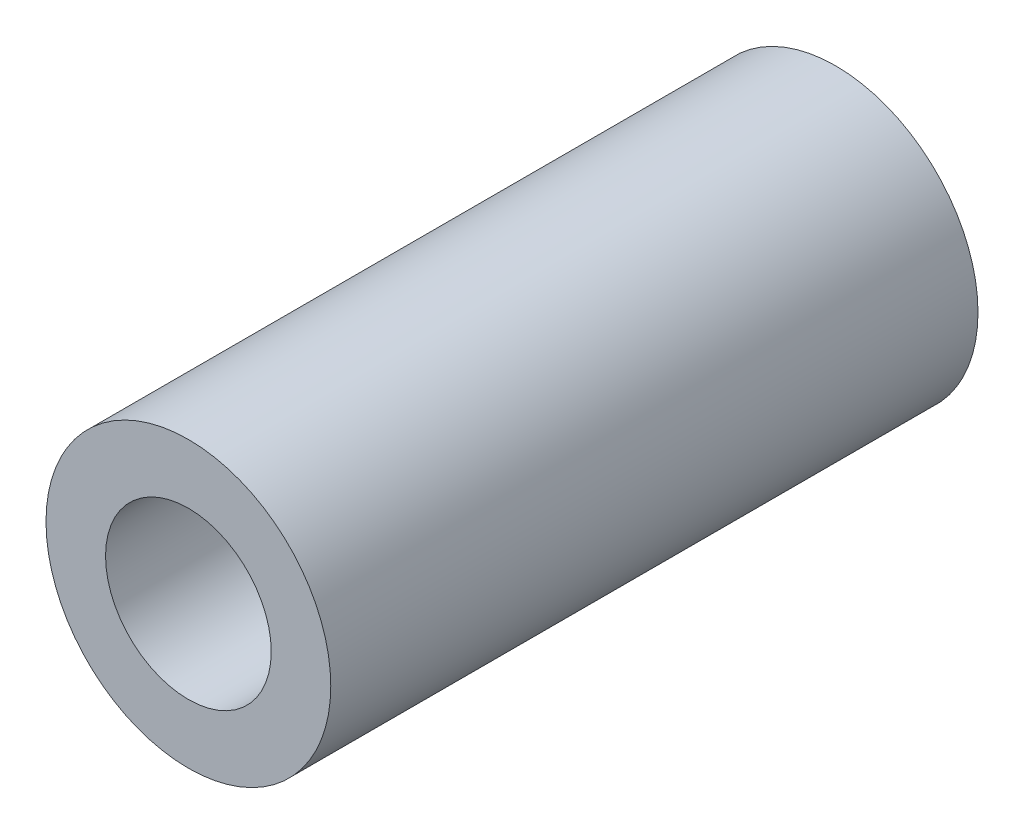
ISO-10303-21;
HEADER;
FILE_DESCRIPTION(('STEP AP214'),'2;1');
FILE_NAME('part.step','',(''),(''),'','','');
FILE_SCHEMA(('AUTOMOTIVE_DESIGN { 1 0 10303 214 1 1 1 1 }'));
ENDSEC;
DATA;
#1=APPLICATION_CONTEXT('core data for automotive mechanical design processes');
#2=APPLICATION_PROTOCOL_DEFINITION('international standard','automotive_design',2000,#1);
#3=PRODUCT_CONTEXT('',#1,'mechanical');
#4=PRODUCT('Part','Part','',(#3));
#5=PRODUCT_RELATED_PRODUCT_CATEGORY('part','',(#4));
#6=PRODUCT_DEFINITION_FORMATION('','',#4);
#7=PRODUCT_DEFINITION_CONTEXT('part definition',#1,'design');
#8=PRODUCT_DEFINITION('design','',#6,#7);
#9=PRODUCT_DEFINITION_SHAPE('','',#8);
#10=(LENGTH_UNIT() NAMED_UNIT(*) SI_UNIT(.MILLI.,.METRE.));
#11=(NAMED_UNIT(*) PLANE_ANGLE_UNIT() SI_UNIT($,.RADIAN.));
#12=(NAMED_UNIT(*) SI_UNIT($,.STERADIAN.) SOLID_ANGLE_UNIT());
#13=UNCERTAINTY_MEASURE_WITH_UNIT(LENGTH_MEASURE(1.E-05),#10,'distance_accuracy_value','');
#14=(GEOMETRIC_REPRESENTATION_CONTEXT(3) GLOBAL_UNCERTAINTY_ASSIGNED_CONTEXT((#13)) GLOBAL_UNIT_ASSIGNED_CONTEXT((#10,
#11,#12)) REPRESENTATION_CONTEXT('',''));
#15=CARTESIAN_POINT('',(0.,0.,0.));
#16=DIRECTION('',(0.,0.,1.));
#17=DIRECTION('',(1.,0.,0.));
#18=AXIS2_PLACEMENT_3D('',#15,#16,#17);
#19=CARTESIAN_POINT('',(0.,0.,12.5));
#20=DIRECTION('',(0.,0.,1.));
#21=DIRECTION('',(1.,0.,0.));
#22=AXIS2_PLACEMENT_3D('',#19,#20,#21);
#23=PLANE('',#22);
#24=CARTESIAN_POINT('',(0.,0.,12.5));
#25=DIRECTION('',(0.,0.,1.));
#26=DIRECTION('',(1.,0.,0.));
#27=AXIS2_PLACEMENT_3D('',#24,#25,#26);
#28=CIRCLE('',#27,2.75);
#29=CARTESIAN_POINT('',(2.75,0.,12.5));
#30=VERTEX_POINT('',#29);
#31=EDGE_CURVE('E10',#30,#30,#28,.T.);
#32=ORIENTED_EDGE('',*,*,#31,.T.);
#33=EDGE_LOOP('',(#32));
#34=FACE_BOUND('',#33,.T.);
#35=CARTESIAN_POINT('',(0.,0.,12.5));
#36=DIRECTION('',(0.,0.,1.));
#37=DIRECTION('',(1.,0.,0.));
#38=AXIS2_PLACEMENT_3D('',#35,#36,#37);
#39=CIRCLE('',#38,1.6);
#40=CARTESIAN_POINT('',(1.6,0.,12.5));
#41=VERTEX_POINT('',#40);
#42=EDGE_CURVE('E50',#41,#41,#39,.T.);
#43=ORIENTED_EDGE('',*,*,#42,.F.);
#44=EDGE_LOOP('',(#43));
#45=FACE_BOUND('',#44,.T.);
#46=ADVANCED_FACE('F39',(#34,#45),#23,.T.);
#47=CARTESIAN_POINT('',(0.,0.,0.));
#48=DIRECTION('',(0.,0.,1.));
#49=DIRECTION('',(1.,0.,0.));
#50=AXIS2_PLACEMENT_3D('',#47,#48,#49);
#51=PLANE('',#50);
#52=CARTESIAN_POINT('',(0.,0.,0.));
#53=DIRECTION('',(0.,0.,1.));
#54=DIRECTION('',(1.,0.,0.));
#55=AXIS2_PLACEMENT_3D('',#52,#53,#54);
#56=CIRCLE('',#55,2.75);
#57=CARTESIAN_POINT('',(2.75,0.,0.));
#58=VERTEX_POINT('',#57);
#59=EDGE_CURVE('E43',#58,#58,#56,.T.);
#60=ORIENTED_EDGE('',*,*,#59,.F.);
#61=EDGE_LOOP('',(#60));
#62=FACE_BOUND('',#61,.T.);
#63=CARTESIAN_POINT('',(0.,0.,0.));
#64=DIRECTION('',(0.,0.,1.));
#65=DIRECTION('',(1.,0.,0.));
#66=AXIS2_PLACEMENT_3D('',#63,#64,#65);
#67=CIRCLE('',#66,1.6);
#68=CARTESIAN_POINT('',(1.6,0.,0.));
#69=VERTEX_POINT('',#68);
#70=EDGE_CURVE('E52',#69,#69,#67,.T.);
#71=ORIENTED_EDGE('',*,*,#70,.T.);
#72=EDGE_LOOP('',(#71));
#73=FACE_BOUND('',#72,.T.);
#74=ADVANCED_FACE('F62',(#62,#73),#51,.F.);
#75=CARTESIAN_POINT('',(0.,0.,12.5));
#76=DIRECTION('',(0.,0.,-1.));
#77=DIRECTION('',(-1.,0.,0.));
#78=AXIS2_PLACEMENT_3D('',#75,#76,#77);
#79=CYLINDRICAL_SURFACE('',#78,2.75);
#80=ORIENTED_EDGE('',*,*,#31,.F.);
#81=EDGE_LOOP('',(#80));
#82=FACE_BOUND('',#81,.T.);
#83=ORIENTED_EDGE('',*,*,#59,.T.);
#84=EDGE_LOOP('',(#83));
#85=FACE_BOUND('',#84,.T.);
#86=ADVANCED_FACE('F41',(#82,#85),#79,.T.);
#87=CARTESIAN_POINT('',(0.,0.,12.5));
#88=DIRECTION('',(0.,0.,-1.));
#89=DIRECTION('',(-1.,0.,0.));
#90=AXIS2_PLACEMENT_3D('',#87,#88,#89);
#91=CYLINDRICAL_SURFACE('',#90,1.6);
#92=ORIENTED_EDGE('',*,*,#42,.T.);
#93=EDGE_LOOP('',(#92));
#94=FACE_BOUND('',#93,.T.);
#95=ORIENTED_EDGE('',*,*,#70,.F.);
#96=EDGE_LOOP('',(#95));
#97=FACE_BOUND('',#96,.T.);
#98=ADVANCED_FACE('F58',(#94,#97),#91,.F.);
#99=CLOSED_SHELL('',(#46,#74,#86,#98));
#100=MANIFOLD_SOLID_BREP('B2',#99);
#101=ADVANCED_BREP_SHAPE_REPRESENTATION('',(#18,#100),#14);
#102=SHAPE_DEFINITION_REPRESENTATION(#9,#101);
ENDSEC;
END-ISO-10303-21;
